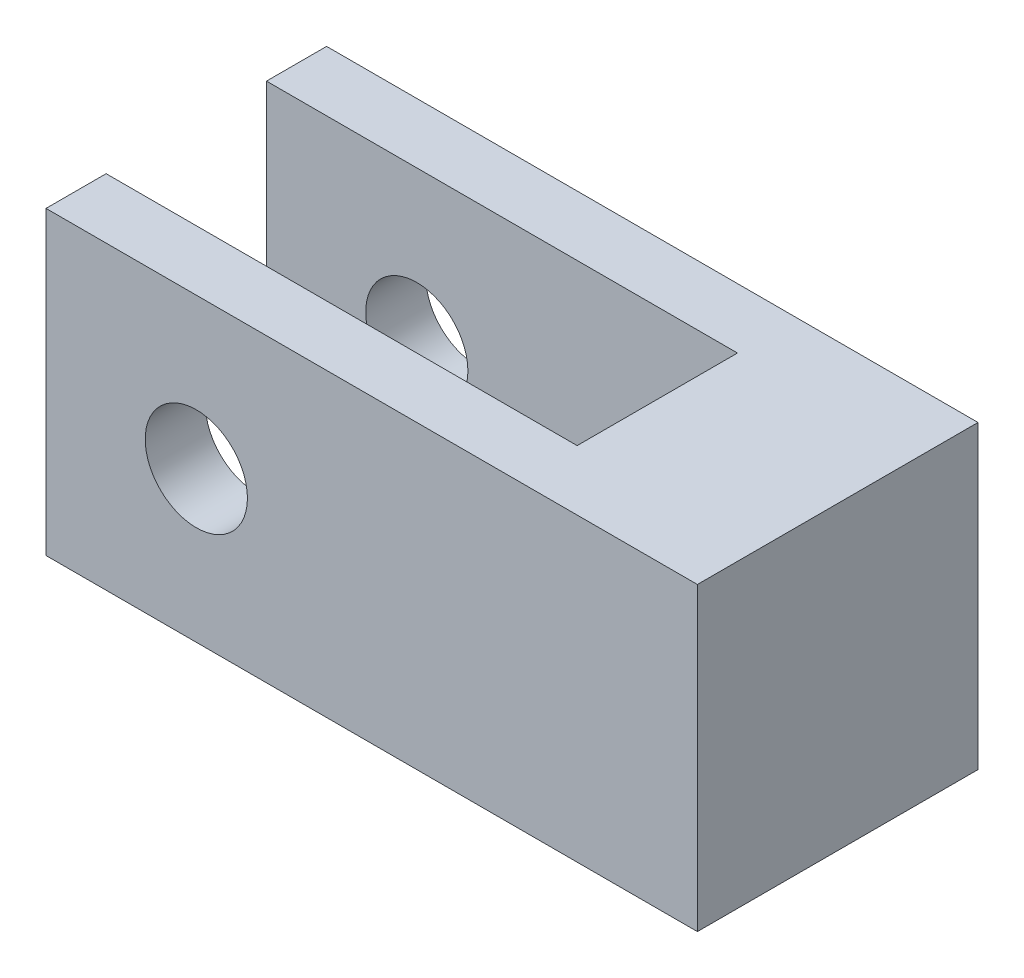
ISO-10303-21;
HEADER;
FILE_DESCRIPTION(('STEP AP214'),'2;1');
FILE_NAME('part.step','',(''),(''),'','','');
FILE_SCHEMA(('AUTOMOTIVE_DESIGN { 1 0 10303 214 1 1 1 1 }'));
ENDSEC;
DATA;
#1=APPLICATION_CONTEXT('core data for automotive mechanical design processes');
#2=APPLICATION_PROTOCOL_DEFINITION('international standard','automotive_design',2000,#1);
#3=PRODUCT_CONTEXT('',#1,'mechanical');
#4=PRODUCT('Part','Part','',(#3));
#5=PRODUCT_RELATED_PRODUCT_CATEGORY('part','',(#4));
#6=PRODUCT_DEFINITION_FORMATION('','',#4);
#7=PRODUCT_DEFINITION_CONTEXT('part definition',#1,'design');
#8=PRODUCT_DEFINITION('design','',#6,#7);
#9=PRODUCT_DEFINITION_SHAPE('','',#8);
#10=(LENGTH_UNIT() NAMED_UNIT(*) SI_UNIT(.MILLI.,.METRE.));
#11=(NAMED_UNIT(*) PLANE_ANGLE_UNIT() SI_UNIT($,.RADIAN.));
#12=(NAMED_UNIT(*) SI_UNIT($,.STERADIAN.) SOLID_ANGLE_UNIT());
#13=UNCERTAINTY_MEASURE_WITH_UNIT(LENGTH_MEASURE(1.E-05),#10,'distance_accuracy_value','');
#14=(GEOMETRIC_REPRESENTATION_CONTEXT(3) GLOBAL_UNCERTAINTY_ASSIGNED_CONTEXT((#13)) GLOBAL_UNIT_ASSIGNED_CONTEXT((#10,
#11,#12)) REPRESENTATION_CONTEXT('',''));
#15=CARTESIAN_POINT('',(0.,0.,0.));
#16=DIRECTION('',(0.,0.,1.));
#17=DIRECTION('',(1.,0.,0.));
#18=AXIS2_PLACEMENT_3D('',#15,#16,#17);
#19=CARTESIAN_POINT('',(-15.,15.,14.));
#20=DIRECTION('',(1.,0.,0.));
#21=DIRECTION('',(0.,1.,0.));
#22=AXIS2_PLACEMENT_3D('',#19,#20,#21);
#23=PLANE('',#22);
#24=DIRECTION('',(0.,-1.,0.));
#25=VECTOR('',#24,1.);
#26=CARTESIAN_POINT('',(-15.,15.,-8.));
#27=LINE('',#26,#25);
#28=CARTESIAN_POINT('',(-15.,15.,-8.));
#29=VERTEX_POINT('',#28);
#30=CARTESIAN_POINT('',(-15.,-15.,-8.));
#31=VERTEX_POINT('',#30);
#32=EDGE_CURVE('E144',#29,#31,#27,.T.);
#33=ORIENTED_EDGE('',*,*,#32,.F.);
#34=DIRECTION('',(0.,0.,-1.));
#35=VECTOR('',#34,1.);
#36=CARTESIAN_POINT('',(-15.,15.,14.));
#37=LINE('',#36,#35);
#38=CARTESIAN_POINT('',(-15.,15.,-14.));
#39=VERTEX_POINT('',#38);
#40=EDGE_CURVE('E91',#29,#39,#37,.T.);
#41=ORIENTED_EDGE('',*,*,#40,.T.);
#42=DIRECTION('',(0.,-1.,0.));
#43=VECTOR('',#42,1.);
#44=CARTESIAN_POINT('',(-15.,15.,-14.));
#45=LINE('',#44,#43);
#46=CARTESIAN_POINT('',(-15.,-15.,-14.));
#47=VERTEX_POINT('',#46);
#48=EDGE_CURVE('E131',#39,#47,#45,.T.);
#49=ORIENTED_EDGE('',*,*,#48,.T.);
#50=DIRECTION('',(0.,0.,-1.));
#51=VECTOR('',#50,1.);
#52=CARTESIAN_POINT('',(-15.,-15.,14.));
#53=LINE('',#52,#51);
#54=EDGE_CURVE('E186',#31,#47,#53,.T.);
#55=ORIENTED_EDGE('',*,*,#54,.F.);
#56=EDGE_LOOP('',(#33,#41,#49,#55));
#57=FACE_BOUND('',#56,.T.);
#58=ADVANCED_FACE('F43',(#57),#23,.F.);
#59=CARTESIAN_POINT('',(-15.,-15.,14.));
#60=DIRECTION('',(0.,1.,0.));
#61=DIRECTION('',(0.,0.,1.));
#62=AXIS2_PLACEMENT_3D('',#59,#60,#61);
#63=PLANE('',#62);
#64=DIRECTION('',(1.,0.,0.));
#65=VECTOR('',#64,1.);
#66=CARTESIAN_POINT('',(-15.,-15.,-8.));
#67=LINE('',#66,#65);
#68=CARTESIAN_POINT('',(32.,-15.,-8.));
#69=VERTEX_POINT('',#68);
#70=EDGE_CURVE('E132',#31,#69,#67,.T.);
#71=ORIENTED_EDGE('',*,*,#70,.F.);
#72=ORIENTED_EDGE('',*,*,#54,.T.);
#73=DIRECTION('',(1.,0.,0.));
#74=VECTOR('',#73,1.);
#75=CARTESIAN_POINT('',(-15.,-15.,-14.));
#76=LINE('',#75,#74);
#77=CARTESIAN_POINT('',(50.,-15.,-14.));
#78=VERTEX_POINT('',#77);
#79=EDGE_CURVE('E166',#47,#78,#76,.T.);
#80=ORIENTED_EDGE('',*,*,#79,.T.);
#81=DIRECTION('',(0.,0.,-1.));
#82=VECTOR('',#81,1.);
#83=CARTESIAN_POINT('',(50.,-15.,14.));
#84=LINE('',#83,#82);
#85=CARTESIAN_POINT('',(50.,-15.,14.));
#86=VERTEX_POINT('',#85);
#87=EDGE_CURVE('E182',#86,#78,#84,.T.);
#88=ORIENTED_EDGE('',*,*,#87,.F.);
#89=DIRECTION('',(1.,0.,0.));
#90=VECTOR('',#89,1.);
#91=CARTESIAN_POINT('',(-15.,-15.,14.));
#92=LINE('',#91,#90);
#93=CARTESIAN_POINT('',(-15.,-15.,14.));
#94=VERTEX_POINT('',#93);
#95=EDGE_CURVE('E99',#94,#86,#92,.T.);
#96=ORIENTED_EDGE('',*,*,#95,.F.);
#97=CARTESIAN_POINT('',(-15.,-15.,8.));
#98=VERTEX_POINT('',#97);
#99=EDGE_CURVE('E142',#94,#98,#53,.T.);
#100=ORIENTED_EDGE('',*,*,#99,.T.);
#101=DIRECTION('',(1.,0.,0.));
#102=VECTOR('',#101,1.);
#103=CARTESIAN_POINT('',(-15.,-15.,8.));
#104=LINE('',#103,#102);
#105=CARTESIAN_POINT('',(32.,-15.,8.));
#106=VERTEX_POINT('',#105);
#107=EDGE_CURVE('E135',#98,#106,#104,.T.);
#108=ORIENTED_EDGE('',*,*,#107,.T.);
#109=DIRECTION('',(0.,0.,-1.));
#110=VECTOR('',#109,1.);
#111=CARTESIAN_POINT('',(32.,-15.,14.));
#112=LINE('',#111,#110);
#113=EDGE_CURVE('E121',#106,#69,#112,.T.);
#114=ORIENTED_EDGE('',*,*,#113,.T.);
#115=EDGE_LOOP('',(#71,#72,#80,#88,#96,#100,#108,#114));
#116=FACE_BOUND('',#115,.T.);
#117=ADVANCED_FACE('F140',(#116),#63,.F.);
#118=CARTESIAN_POINT('',(-15.,15.,14.));
#119=DIRECTION('',(0.,-1.,0.));
#120=DIRECTION('',(0.,0.,-1.));
#121=AXIS2_PLACEMENT_3D('',#118,#119,#120);
#122=PLANE('',#121);
#123=DIRECTION('',(-1.,0.,0.));
#124=VECTOR('',#123,1.);
#125=CARTESIAN_POINT('',(-15.,15.,-8.));
#126=LINE('',#125,#124);
#127=CARTESIAN_POINT('',(32.,15.,-8.));
#128=VERTEX_POINT('',#127);
#129=EDGE_CURVE('E11',#128,#29,#126,.T.);
#130=ORIENTED_EDGE('',*,*,#129,.F.);
#131=DIRECTION('',(0.,0.,1.));
#132=VECTOR('',#131,1.);
#133=CARTESIAN_POINT('',(32.,15.,14.));
#134=LINE('',#133,#132);
#135=CARTESIAN_POINT('',(32.,15.,8.));
#136=VERTEX_POINT('',#135);
#137=EDGE_CURVE('E53',#128,#136,#134,.T.);
#138=ORIENTED_EDGE('',*,*,#137,.T.);
#139=DIRECTION('',(-1.,0.,0.));
#140=VECTOR('',#139,1.);
#141=CARTESIAN_POINT('',(-15.,15.,8.));
#142=LINE('',#141,#140);
#143=CARTESIAN_POINT('',(-15.,15.,8.));
#144=VERTEX_POINT('',#143);
#145=EDGE_CURVE('E136',#136,#144,#142,.T.);
#146=ORIENTED_EDGE('',*,*,#145,.T.);
#147=CARTESIAN_POINT('',(-15.,15.,14.));
#148=VERTEX_POINT('',#147);
#149=EDGE_CURVE('E174',#148,#144,#37,.T.);
#150=ORIENTED_EDGE('',*,*,#149,.F.);
#151=DIRECTION('',(-1.,0.,0.));
#152=VECTOR('',#151,1.);
#153=CARTESIAN_POINT('',(-15.,15.,14.));
#154=LINE('',#153,#152);
#155=CARTESIAN_POINT('',(50.,15.,14.));
#156=VERTEX_POINT('',#155);
#157=EDGE_CURVE('E69',#156,#148,#154,.T.);
#158=ORIENTED_EDGE('',*,*,#157,.F.);
#159=DIRECTION('',(0.,0.,-1.));
#160=VECTOR('',#159,1.);
#161=CARTESIAN_POINT('',(50.,15.,14.));
#162=LINE('',#161,#160);
#163=CARTESIAN_POINT('',(50.,15.,-14.));
#164=VERTEX_POINT('',#163);
#165=EDGE_CURVE('E178',#156,#164,#162,.T.);
#166=ORIENTED_EDGE('',*,*,#165,.T.);
#167=DIRECTION('',(-1.,0.,0.));
#168=VECTOR('',#167,1.);
#169=CARTESIAN_POINT('',(-15.,15.,-14.));
#170=LINE('',#169,#168);
#171=EDGE_CURVE('E156',#164,#39,#170,.T.);
#172=ORIENTED_EDGE('',*,*,#171,.T.);
#173=ORIENTED_EDGE('',*,*,#40,.F.);
#174=EDGE_LOOP('',(#130,#138,#146,#150,#158,#166,#172,#173));
#175=FACE_BOUND('',#174,.T.);
#176=ADVANCED_FACE('F194',(#175),#122,.F.);
#177=ORIENTED_EDGE('',*,*,#149,.T.);
#178=DIRECTION('',(0.,-1.,0.));
#179=VECTOR('',#178,1.);
#180=CARTESIAN_POINT('',(-15.,15.,8.));
#181=LINE('',#180,#179);
#182=EDGE_CURVE('E60',#144,#98,#181,.T.);
#183=ORIENTED_EDGE('',*,*,#182,.T.);
#184=ORIENTED_EDGE('',*,*,#99,.F.);
#185=DIRECTION('',(0.,-1.,0.));
#186=VECTOR('',#185,1.);
#187=CARTESIAN_POINT('',(-15.,15.,14.));
#188=LINE('',#187,#186);
#189=EDGE_CURVE('E153',#148,#94,#188,.T.);
#190=ORIENTED_EDGE('',*,*,#189,.F.);
#191=EDGE_LOOP('',(#177,#183,#184,#190));
#192=FACE_BOUND('',#191,.T.);
#193=ADVANCED_FACE('F45',(#192),#23,.F.);
#194=CARTESIAN_POINT('',(50.,15.,14.));
#195=DIRECTION('',(-1.,0.,0.));
#196=DIRECTION('',(0.,0.,1.));
#197=AXIS2_PLACEMENT_3D('',#194,#195,#196);
#198=PLANE('',#197);
#199=DIRECTION('',(0.,1.,0.));
#200=VECTOR('',#199,1.);
#201=CARTESIAN_POINT('',(50.,15.,-14.));
#202=LINE('',#201,#200);
#203=EDGE_CURVE('E169',#78,#164,#202,.T.);
#204=ORIENTED_EDGE('',*,*,#203,.T.);
#205=ORIENTED_EDGE('',*,*,#165,.F.);
#206=DIRECTION('',(0.,1.,0.));
#207=VECTOR('',#206,1.);
#208=CARTESIAN_POINT('',(50.,15.,14.));
#209=LINE('',#208,#207);
#210=EDGE_CURVE('E159',#86,#156,#209,.T.);
#211=ORIENTED_EDGE('',*,*,#210,.F.);
#212=ORIENTED_EDGE('',*,*,#87,.T.);
#213=EDGE_LOOP('',(#204,#205,#211,#212));
#214=FACE_BOUND('',#213,.T.);
#215=ADVANCED_FACE('F218',(#214),#198,.F.);
#216=CARTESIAN_POINT('',(0.,0.,14.));
#217=DIRECTION('',(0.,0.,1.));
#218=DIRECTION('',(1.,0.,0.));
#219=AXIS2_PLACEMENT_3D('',#216,#217,#218);
#220=PLANE('',#219);
#221=CARTESIAN_POINT('',(0.,0.,14.));
#222=DIRECTION('',(0.,0.,1.));
#223=DIRECTION('',(1.,0.,0.));
#224=AXIS2_PLACEMENT_3D('',#221,#222,#223);
#225=CIRCLE('',#224,5.1);
#226=CARTESIAN_POINT('',(5.1,0.,14.));
#227=VERTEX_POINT('',#226);
#228=EDGE_CURVE('E207',#227,#227,#225,.T.);
#229=ORIENTED_EDGE('',*,*,#228,.F.);
#230=EDGE_LOOP('',(#229));
#231=FACE_BOUND('',#230,.T.);
#232=ORIENTED_EDGE('',*,*,#189,.T.);
#233=ORIENTED_EDGE('',*,*,#95,.T.);
#234=ORIENTED_EDGE('',*,*,#210,.T.);
#235=ORIENTED_EDGE('',*,*,#157,.T.);
#236=EDGE_LOOP('',(#232,#233,#234,#235));
#237=FACE_BOUND('',#236,.T.);
#238=ADVANCED_FACE('F215',(#231,#237),#220,.T.);
#239=CARTESIAN_POINT('',(0.,0.,-14.));
#240=DIRECTION('',(0.,0.,1.));
#241=DIRECTION('',(1.,0.,0.));
#242=AXIS2_PLACEMENT_3D('',#239,#240,#241);
#243=PLANE('',#242);
#244=CARTESIAN_POINT('',(0.,0.,-14.));
#245=DIRECTION('',(0.,0.,1.));
#246=DIRECTION('',(1.,0.,0.));
#247=AXIS2_PLACEMENT_3D('',#244,#245,#246);
#248=CIRCLE('',#247,5.1);
#249=CARTESIAN_POINT('',(5.1,0.,-14.));
#250=VERTEX_POINT('',#249);
#251=EDGE_CURVE('E203',#250,#250,#248,.T.);
#252=ORIENTED_EDGE('',*,*,#251,.T.);
#253=EDGE_LOOP('',(#252));
#254=FACE_BOUND('',#253,.T.);
#255=ORIENTED_EDGE('',*,*,#48,.F.);
#256=ORIENTED_EDGE('',*,*,#171,.F.);
#257=ORIENTED_EDGE('',*,*,#203,.F.);
#258=ORIENTED_EDGE('',*,*,#79,.F.);
#259=EDGE_LOOP('',(#255,#256,#257,#258));
#260=FACE_BOUND('',#259,.T.);
#261=ADVANCED_FACE('F217',(#254,#260),#243,.F.);
#262=CARTESIAN_POINT('',(32.,16.,-8.));
#263=DIRECTION('',(1.,0.,0.));
#264=DIRECTION('',(0.,1.,0.));
#265=AXIS2_PLACEMENT_3D('',#262,#263,#264);
#266=PLANE('',#265);
#267=DIRECTION('',(0.,1.,0.));
#268=VECTOR('',#267,1.);
#269=CARTESIAN_POINT('',(32.,16.,8.));
#270=LINE('',#269,#268);
#271=EDGE_CURVE('E124',#106,#136,#270,.T.);
#272=ORIENTED_EDGE('',*,*,#271,.T.);
#273=ORIENTED_EDGE('',*,*,#137,.F.);
#274=DIRECTION('',(0.,1.,0.));
#275=VECTOR('',#274,1.);
#276=CARTESIAN_POINT('',(32.,16.,-8.));
#277=LINE('',#276,#275);
#278=EDGE_CURVE('E127',#69,#128,#277,.T.);
#279=ORIENTED_EDGE('',*,*,#278,.F.);
#280=ORIENTED_EDGE('',*,*,#113,.F.);
#281=EDGE_LOOP('',(#272,#273,#279,#280));
#282=FACE_BOUND('',#281,.T.);
#283=ADVANCED_FACE('F123',(#282),#266,.F.);
#284=CARTESIAN_POINT('',(0.,0.,-8.));
#285=DIRECTION('',(0.,0.,1.));
#286=DIRECTION('',(1.,0.,0.));
#287=AXIS2_PLACEMENT_3D('',#284,#285,#286);
#288=PLANE('',#287);
#289=CARTESIAN_POINT('',(0.,0.,-8.));
#290=DIRECTION('',(0.,0.,1.));
#291=DIRECTION('',(1.,0.,0.));
#292=AXIS2_PLACEMENT_3D('',#289,#290,#291);
#293=CIRCLE('',#292,5.1);
#294=CARTESIAN_POINT('',(5.1,0.,-8.));
#295=VERTEX_POINT('',#294);
#296=EDGE_CURVE('E138',#295,#295,#293,.T.);
#297=ORIENTED_EDGE('',*,*,#296,.F.);
#298=EDGE_LOOP('',(#297));
#299=FACE_BOUND('',#298,.T.);
#300=ORIENTED_EDGE('',*,*,#70,.T.);
#301=ORIENTED_EDGE('',*,*,#278,.T.);
#302=ORIENTED_EDGE('',*,*,#129,.T.);
#303=ORIENTED_EDGE('',*,*,#32,.T.);
#304=EDGE_LOOP('',(#300,#301,#302,#303));
#305=FACE_BOUND('',#304,.T.);
#306=ADVANCED_FACE('F196',(#299,#305),#288,.T.);
#307=CARTESIAN_POINT('',(0.,0.,8.));
#308=DIRECTION('',(0.,0.,1.));
#309=DIRECTION('',(1.,0.,0.));
#310=AXIS2_PLACEMENT_3D('',#307,#308,#309);
#311=PLANE('',#310);
#312=CARTESIAN_POINT('',(0.,0.,8.));
#313=DIRECTION('',(0.,0.,1.));
#314=DIRECTION('',(1.,0.,0.));
#315=AXIS2_PLACEMENT_3D('',#312,#313,#314);
#316=CIRCLE('',#315,5.1);
#317=CARTESIAN_POINT('',(5.1,0.,8.));
#318=VERTEX_POINT('',#317);
#319=EDGE_CURVE('E47',#318,#318,#316,.T.);
#320=ORIENTED_EDGE('',*,*,#319,.T.);
#321=EDGE_LOOP('',(#320));
#322=FACE_BOUND('',#321,.T.);
#323=ORIENTED_EDGE('',*,*,#182,.F.);
#324=ORIENTED_EDGE('',*,*,#145,.F.);
#325=ORIENTED_EDGE('',*,*,#271,.F.);
#326=ORIENTED_EDGE('',*,*,#107,.F.);
#327=EDGE_LOOP('',(#323,#324,#325,#326));
#328=FACE_BOUND('',#327,.T.);
#329=ADVANCED_FACE('F134',(#322,#328),#311,.F.);
#330=CARTESIAN_POINT('',(0.,0.,-14.));
#331=DIRECTION('',(0.,0.,1.));
#332=DIRECTION('',(1.,0.,0.));
#333=AXIS2_PLACEMENT_3D('',#330,#331,#332);
#334=CYLINDRICAL_SURFACE('',#333,5.1);
#335=ORIENTED_EDGE('',*,*,#228,.T.);
#336=EDGE_LOOP('',(#335));
#337=FACE_BOUND('',#336,.T.);
#338=ORIENTED_EDGE('',*,*,#319,.F.);
#339=EDGE_LOOP('',(#338));
#340=FACE_BOUND('',#339,.T.);
#341=ADVANCED_FACE('F212',(#337,#340),#334,.F.);
#342=ORIENTED_EDGE('',*,*,#296,.T.);
#343=EDGE_LOOP('',(#342));
#344=FACE_BOUND('',#343,.T.);
#345=ORIENTED_EDGE('',*,*,#251,.F.);
#346=EDGE_LOOP('',(#345));
#347=FACE_BOUND('',#346,.T.);
#348=ADVANCED_FACE('F260',(#344,#347),#334,.F.);
#349=CLOSED_SHELL('',(#58,#117,#176,#193,#215,#238,#261,#283,#306,#329,#341,#348));
#350=MANIFOLD_SOLID_BREP('B2',#349);
#351=ADVANCED_BREP_SHAPE_REPRESENTATION('',(#18,#350),#14);
#352=SHAPE_DEFINITION_REPRESENTATION(#9,#351);
ENDSEC;
END-ISO-10303-21;
